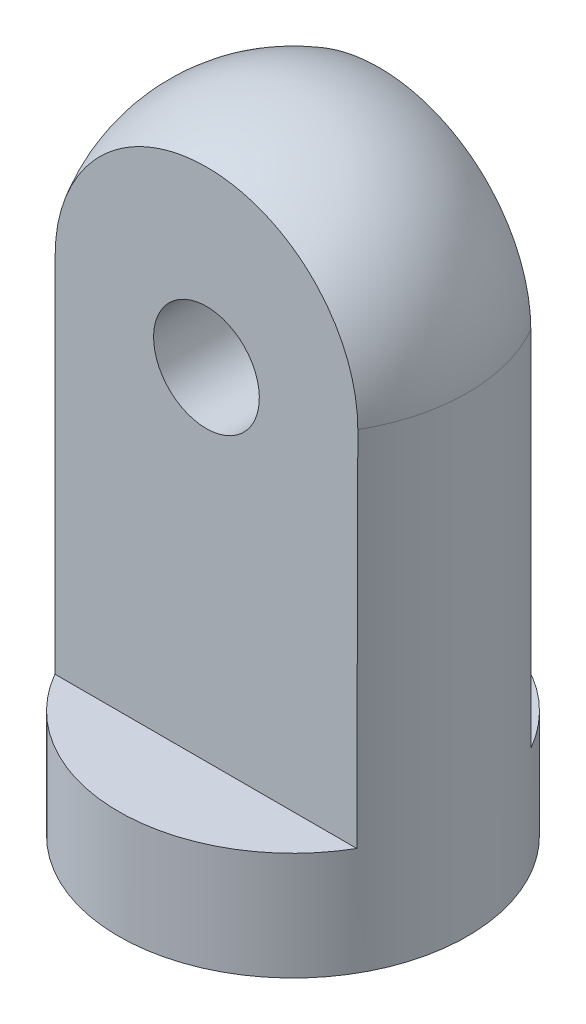
ISO-10303-21;
HEADER;
FILE_DESCRIPTION(('STEP AP214'),'2;1');
FILE_NAME('part.step','',(''),(''),'','','');
FILE_SCHEMA(('AUTOMOTIVE_DESIGN { 1 0 10303 214 1 1 1 1 }'));
ENDSEC;
DATA;
#1=APPLICATION_CONTEXT('core data for automotive mechanical design processes');
#2=APPLICATION_PROTOCOL_DEFINITION('international standard','automotive_design',2000,#1);
#3=PRODUCT_CONTEXT('',#1,'mechanical');
#4=PRODUCT('Part','Part','',(#3));
#5=PRODUCT_RELATED_PRODUCT_CATEGORY('part','',(#4));
#6=PRODUCT_DEFINITION_FORMATION('','',#4);
#7=PRODUCT_DEFINITION_CONTEXT('part definition',#1,'design');
#8=PRODUCT_DEFINITION('design','',#6,#7);
#9=PRODUCT_DEFINITION_SHAPE('','',#8);
#10=(LENGTH_UNIT() NAMED_UNIT(*) SI_UNIT(.MILLI.,.METRE.));
#11=(NAMED_UNIT(*) PLANE_ANGLE_UNIT() SI_UNIT($,.RADIAN.));
#12=(NAMED_UNIT(*) SI_UNIT($,.STERADIAN.) SOLID_ANGLE_UNIT());
#13=UNCERTAINTY_MEASURE_WITH_UNIT(LENGTH_MEASURE(1.E-05),#10,'distance_accuracy_value','');
#14=(GEOMETRIC_REPRESENTATION_CONTEXT(3) GLOBAL_UNCERTAINTY_ASSIGNED_CONTEXT((#13)) GLOBAL_UNIT_ASSIGNED_CONTEXT((#10,
#11,#12)) REPRESENTATION_CONTEXT('',''));
#15=CARTESIAN_POINT('',(0.,0.,0.));
#16=DIRECTION('',(0.,0.,1.));
#17=DIRECTION('',(1.,0.,0.));
#18=AXIS2_PLACEMENT_3D('',#15,#16,#17);
#19=CARTESIAN_POINT('',(0.,34.29,0.));
#20=DIRECTION('',(0.,1.,0.));
#21=DIRECTION('',(1.,0.,0.));
#22=AXIS2_PLACEMENT_3D('',#19,#20,#21);
#23=SPHERICAL_SURFACE('',#22,12.7);
#24=CARTESIAN_POINT('',(0.,34.29,0.));
#25=DIRECTION('',(0.,1.,0.));
#26=DIRECTION('',(-1.,0.,0.));
#27=AXIS2_PLACEMENT_3D('',#24,#25,#26);
#28=CIRCLE('',#27,12.7);
#29=CARTESIAN_POINT('',(11.0255586232644,34.29,6.30294034915132));
#30=VERTEX_POINT('',#29);
#31=CARTESIAN_POINT('',(11.0255586232644,34.29,-6.30294034915132));
#32=VERTEX_POINT('',#31);
#33=EDGE_CURVE('E101',#30,#32,#28,.T.);
#34=ORIENTED_EDGE('',*,*,#33,.T.);
#35=CARTESIAN_POINT('',(0.,34.3012279475094,-6.30292034781887));
#36=DIRECTION('',(0.,-0.00178138530629256,0.999998413331937));
#37=DIRECTION('',(0.,-0.999998413331937,-0.00178138530629256));
#38=AXIS2_PLACEMENT_3D('',#35,#36,#37);
#39=CIRCLE('',#38,11.0255643403068);
#40=CARTESIAN_POINT('',(-11.0255586232644,34.29,-6.30294034915132));
#41=VERTEX_POINT('',#40);
#42=EDGE_CURVE('E57',#32,#41,#39,.T.);
#43=ORIENTED_EDGE('',*,*,#42,.T.);
#44=CARTESIAN_POINT('',(-11.0255586232644,34.29,6.30294034915132));
#45=VERTEX_POINT('',#44);
#46=EDGE_CURVE('E95',#41,#45,#28,.T.);
#47=ORIENTED_EDGE('',*,*,#46,.T.);
#48=CARTESIAN_POINT('',(0.,34.3012279475094,6.30292034781887));
#49=DIRECTION('',(0.,0.00178138530629256,0.999998413331937));
#50=DIRECTION('',(0.,-0.999998413331937,0.00178138530629256));
#51=AXIS2_PLACEMENT_3D('',#48,#49,#50);
#52=CIRCLE('',#51,11.0255643403068);
#53=EDGE_CURVE('E109',#30,#45,#52,.T.);
#54=ORIENTED_EDGE('',*,*,#53,.F.);
#55=EDGE_LOOP('',(#34,#43,#47,#54));
#56=FACE_BOUND('',#55,.T.);
#57=ADVANCED_FACE('F39',(#56),#23,.T.);
#58=CARTESIAN_POINT('',(0.,46.99,0.));
#59=DIRECTION('',(0.,1.,0.));
#60=DIRECTION('',(-1.,0.,0.));
#61=AXIS2_PLACEMENT_3D('',#58,#59,#60);
#62=CYLINDRICAL_SURFACE('',#61,12.7);
#63=CARTESIAN_POINT('',(0.,0.,0.));
#64=DIRECTION('',(0.,1.,0.));
#65=DIRECTION('',(-1.,0.,0.));
#66=AXIS2_PLACEMENT_3D('',#63,#64,#65);
#67=CIRCLE('',#66,12.7);
#68=CARTESIAN_POINT('',(-12.7,0.,0.));
#69=VERTEX_POINT('',#68);
#70=EDGE_CURVE('E102',#69,#69,#67,.T.);
#71=ORIENTED_EDGE('',*,*,#70,.T.);
#72=EDGE_LOOP('',(#71));
#73=FACE_BOUND('',#72,.T.);
#74=ORIENTED_EDGE('',*,*,#46,.F.);
#75=CARTESIAN_POINT('',(-2.36489785522458E-13,3572.50844505662,0.));
#76=DIRECTION('',(0.,-0.00178138530629256,0.999998413331937));
#77=DIRECTION('',(0.,0.999998413331937,0.00178138530629256));
#78=AXIS2_PLACEMENT_3D('',#75,#76,#77);
#79=ELLIPSE('',#78,7129.28301088965,12.7);
#80=CARTESIAN_POINT('',(-10.9985226280624,7.87259551462471,-6.35));
#81=VERTEX_POINT('',#80);
#82=EDGE_CURVE('E11',#41,#81,#79,.T.);
#83=ORIENTED_EDGE('',*,*,#82,.T.);
#84=CARTESIAN_POINT('',(0.,7.87259551462471,0.));
#85=DIRECTION('',(0.,1.,0.));
#86=DIRECTION('',(0.,0.,1.));
#87=AXIS2_PLACEMENT_3D('',#84,#85,#86);
#88=CIRCLE('',#87,12.7);
#89=CARTESIAN_POINT('',(10.9985226280624,7.87259551462471,-6.35));
#90=VERTEX_POINT('',#89);
#91=EDGE_CURVE('E48',#90,#81,#88,.T.);
#92=ORIENTED_EDGE('',*,*,#91,.F.);
#93=EDGE_CURVE('E50',#90,#32,#79,.T.);
#94=ORIENTED_EDGE('',*,*,#93,.T.);
#95=ORIENTED_EDGE('',*,*,#33,.F.);
#96=CARTESIAN_POINT('',(-2.36489785522458E-13,3572.50844505662,0.));
#97=DIRECTION('',(0.,0.00178138530629256,0.999998413331937));
#98=DIRECTION('',(0.,0.999998413331937,-0.00178138530629256));
#99=AXIS2_PLACEMENT_3D('',#96,#97,#98);
#100=ELLIPSE('',#99,7129.28301088965,12.7);
#101=CARTESIAN_POINT('',(10.9985226280624,7.87259551462471,6.35));
#102=VERTEX_POINT('',#101);
#103=EDGE_CURVE('E115',#102,#30,#100,.T.);
#104=ORIENTED_EDGE('',*,*,#103,.F.);
#105=CARTESIAN_POINT('',(0.,7.87259551462471,0.));
#106=DIRECTION('',(0.,1.,0.));
#107=DIRECTION('',(0.,0.,1.));
#108=AXIS2_PLACEMENT_3D('',#105,#106,#107);
#109=CIRCLE('',#108,12.7);
#110=CARTESIAN_POINT('',(-10.9985226280624,7.87259551462471,6.35));
#111=VERTEX_POINT('',#110);
#112=EDGE_CURVE('E107',#111,#102,#109,.T.);
#113=ORIENTED_EDGE('',*,*,#112,.F.);
#114=EDGE_CURVE('E97',#45,#111,#100,.T.);
#115=ORIENTED_EDGE('',*,*,#114,.F.);
#116=EDGE_LOOP('',(#74,#83,#92,#94,#95,#104,#113,#115));
#117=FACE_BOUND('',#116,.T.);
#118=ADVANCED_FACE('F93',(#73,#117),#62,.T.);
#119=CARTESIAN_POINT('',(0.,0.,0.));
#120=DIRECTION('',(0.,1.,0.));
#121=DIRECTION('',(-1.,0.,0.));
#122=AXIS2_PLACEMENT_3D('',#119,#120,#121);
#123=PLANE('',#122);
#124=ORIENTED_EDGE('',*,*,#70,.F.);
#125=EDGE_LOOP('',(#124));
#126=FACE_BOUND('',#125,.T.);
#127=ADVANCED_FACE('F132',(#126),#123,.F.);
#128=CARTESIAN_POINT('',(-12.7,45.3267747939054,6.28327956950947));
#129=DIRECTION('',(0.,0.00178138530629256,0.999998413331937));
#130=DIRECTION('',(0.,-0.999998413331937,0.00178138530629256));
#131=AXIS2_PLACEMENT_3D('',#128,#129,#130);
#132=PLANE('',#131);
#133=CARTESIAN_POINT('',(0.,32.699263680151,6.30577406795386));
#134=DIRECTION('',(0.,0.00178138530629256,0.999998413331937));
#135=DIRECTION('',(0.,-0.999998413331937,0.00178138530629256));
#136=AXIS2_PLACEMENT_3D('',#133,#134,#135);
#137=CIRCLE('',#136,3.85205000851266);
#138=CARTESIAN_POINT('',(0.,28.8472197835631,6.31263605323813));
#139=VERTEX_POINT('',#138);
#140=EDGE_CURVE('E90',#139,#139,#137,.T.);
#141=ORIENTED_EDGE('',*,*,#140,.F.);
#142=EDGE_LOOP('',(#141));
#143=FACE_BOUND('',#142,.T.);
#144=ORIENTED_EDGE('',*,*,#114,.T.);
#145=DIRECTION('',(1.,0.,0.));
#146=VECTOR('',#145,1.);
#147=CARTESIAN_POINT('',(-12.7,7.87259551462471,6.35));
#148=LINE('',#147,#146);
#149=EDGE_CURVE('E64',#111,#102,#148,.T.);
#150=ORIENTED_EDGE('',*,*,#149,.T.);
#151=ORIENTED_EDGE('',*,*,#103,.T.);
#152=ORIENTED_EDGE('',*,*,#53,.T.);
#153=EDGE_LOOP('',(#144,#150,#151,#152));
#154=FACE_BOUND('',#153,.T.);
#155=ADVANCED_FACE('F122',(#143,#154),#132,.T.);
#156=CARTESIAN_POINT('',(-12.7,7.87259551462471,6.35));
#157=DIRECTION('',(0.,1.,0.));
#158=DIRECTION('',(0.,0.,1.));
#159=AXIS2_PLACEMENT_3D('',#156,#157,#158);
#160=PLANE('',#159);
#161=ORIENTED_EDGE('',*,*,#112,.T.);
#162=ORIENTED_EDGE('',*,*,#149,.F.);
#163=EDGE_LOOP('',(#161,#162));
#164=FACE_BOUND('',#163,.T.);
#165=ADVANCED_FACE('F124',(#164),#160,.T.);
#166=CARTESIAN_POINT('',(-12.7,7.87259551462471,-15.471425878429));
#167=DIRECTION('',(0.,1.,0.));
#168=DIRECTION('',(0.,0.,1.));
#169=AXIS2_PLACEMENT_3D('',#166,#167,#168);
#170=PLANE('',#169);
#171=ORIENTED_EDGE('',*,*,#91,.T.);
#172=DIRECTION('',(1.,0.,0.));
#173=VECTOR('',#172,1.);
#174=CARTESIAN_POINT('',(-12.7,7.87259551462471,-6.35));
#175=LINE('',#174,#173);
#176=EDGE_CURVE('E85',#81,#90,#175,.T.);
#177=ORIENTED_EDGE('',*,*,#176,.T.);
#178=EDGE_LOOP('',(#171,#177));
#179=FACE_BOUND('',#178,.T.);
#180=ADVANCED_FACE('F84',(#179),#170,.T.);
#181=CARTESIAN_POINT('',(-12.7,45.3267747939054,-6.28327956950947));
#182=DIRECTION('',(0.,-0.00178138530629256,0.999998413331937));
#183=DIRECTION('',(0.,-0.999998413331937,-0.00178138530629256));
#184=AXIS2_PLACEMENT_3D('',#181,#182,#183);
#185=PLANE('',#184);
#186=CARTESIAN_POINT('',(0.,32.6767975466732,-6.30581408885742));
#187=DIRECTION('',(0.,-0.00178138530629256,0.999998413331937));
#188=DIRECTION('',(0.,0.999998413331937,0.00178138530629256));
#189=AXIS2_PLACEMENT_3D('',#186,#187,#188);
#190=ELLIPSE('',#189,3.85207445634734,3.85205000851266);
#191=CARTESIAN_POINT('',(0.,36.528865891057,-6.29895206002214));
#192=VERTEX_POINT('',#191);
#193=EDGE_CURVE('E42',#192,#192,#190,.T.);
#194=ORIENTED_EDGE('',*,*,#193,.T.);
#195=EDGE_LOOP('',(#194));
#196=FACE_BOUND('',#195,.T.);
#197=ORIENTED_EDGE('',*,*,#42,.F.);
#198=ORIENTED_EDGE('',*,*,#93,.F.);
#199=ORIENTED_EDGE('',*,*,#176,.F.);
#200=ORIENTED_EDGE('',*,*,#82,.F.);
#201=EDGE_LOOP('',(#197,#198,#199,#200));
#202=FACE_BOUND('',#201,.T.);
#203=ADVANCED_FACE('F88',(#196,#202),#185,.F.);
#204=CARTESIAN_POINT('',(0.,32.6653033615384,-12.7581895837614));
#205=DIRECTION('',(0.,0.00178138530629256,0.999998413331936));
#206=DIRECTION('',(0.,-0.999998413331937,0.00178138530629256));
#207=AXIS2_PLACEMENT_3D('',#204,#205,#206);
#208=CYLINDRICAL_SURFACE('',#207,3.85205000851266);
#209=ORIENTED_EDGE('',*,*,#140,.T.);
#210=EDGE_LOOP('',(#209));
#211=FACE_BOUND('',#210,.T.);
#212=ORIENTED_EDGE('',*,*,#193,.F.);
#213=EDGE_LOOP('',(#212));
#214=FACE_BOUND('',#213,.T.);
#215=ADVANCED_FACE('F156',(#211,#214),#208,.F.);
#216=CLOSED_SHELL('',(#57,#118,#127,#155,#165,#180,#203,#215));
#217=MANIFOLD_SOLID_BREP('B2',#216);
#218=ADVANCED_BREP_SHAPE_REPRESENTATION('',(#18,#217),#14);
#219=SHAPE_DEFINITION_REPRESENTATION(#9,#218);
ENDSEC;
END-ISO-10303-21;
